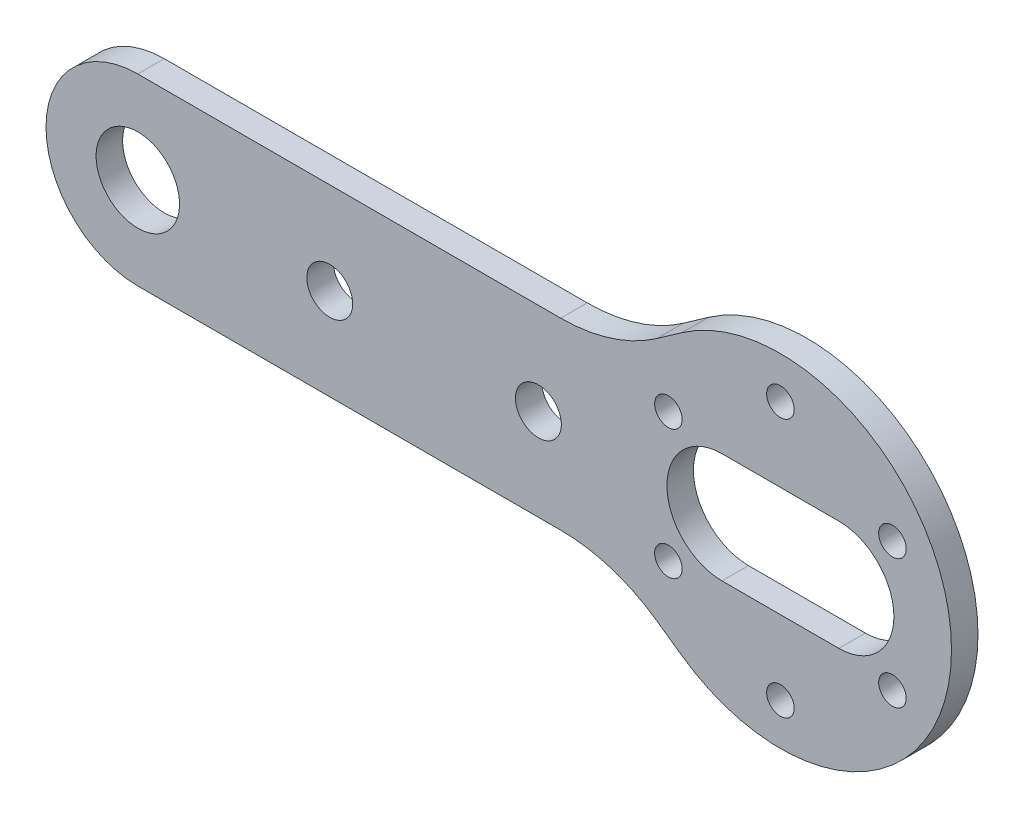
ISO-10303-21;
HEADER;
FILE_DESCRIPTION(('STEP AP214'),'2;1');
FILE_NAME('part.step','',(''),(''),'','','');
FILE_SCHEMA(('AUTOMOTIVE_DESIGN { 1 0 10303 214 1 1 1 1 }'));
ENDSEC;
DATA;
#1=APPLICATION_CONTEXT('core data for automotive mechanical design processes');
#2=APPLICATION_PROTOCOL_DEFINITION('international standard','automotive_design',2000,#1);
#3=PRODUCT_CONTEXT('',#1,'mechanical');
#4=PRODUCT('Part','Part','',(#3));
#5=PRODUCT_RELATED_PRODUCT_CATEGORY('part','',(#4));
#6=PRODUCT_DEFINITION_FORMATION('','',#4);
#7=PRODUCT_DEFINITION_CONTEXT('part definition',#1,'design');
#8=PRODUCT_DEFINITION('design','',#6,#7);
#9=PRODUCT_DEFINITION_SHAPE('','',#8);
#10=(LENGTH_UNIT() NAMED_UNIT(*) SI_UNIT(.MILLI.,.METRE.));
#11=(NAMED_UNIT(*) PLANE_ANGLE_UNIT() SI_UNIT($,.RADIAN.));
#12=(NAMED_UNIT(*) SI_UNIT($,.STERADIAN.) SOLID_ANGLE_UNIT());
#13=UNCERTAINTY_MEASURE_WITH_UNIT(LENGTH_MEASURE(1.E-05),#10,'distance_accuracy_value','');
#14=(GEOMETRIC_REPRESENTATION_CONTEXT(3) GLOBAL_UNCERTAINTY_ASSIGNED_CONTEXT((#13)) GLOBAL_UNIT_ASSIGNED_CONTEXT((#10,
#11,#12)) REPRESENTATION_CONTEXT('',''));
#15=CARTESIAN_POINT('',(0.,0.,0.));
#16=DIRECTION('',(0.,0.,1.));
#17=DIRECTION('',(1.,0.,0.));
#18=AXIS2_PLACEMENT_3D('',#15,#16,#17);
#19=CARTESIAN_POINT('',(94.3510316432399,14.5776463818247,67.3789074823256));
#20=DIRECTION('',(0.,0.,-1.));
#21=DIRECTION('',(-1.,0.,0.));
#22=AXIS2_PLACEMENT_3D('',#19,#20,#21);
#23=PLANE('',#22);
#24=CARTESIAN_POINT('',(65.3510316432399,14.5776463818247,67.3789074823256));
#25=DIRECTION('',(0.,0.,-1.));
#26=DIRECTION('',(-1.,0.,0.));
#27=AXIS2_PLACEMENT_3D('',#24,#25,#26);
#28=CIRCLE('',#27,2.74999999999999);
#29=CARTESIAN_POINT('',(62.6010316432399,14.5776463818247,67.3789074823256));
#30=VERTEX_POINT('',#29);
#31=EDGE_CURVE('E543',#30,#30,#28,.T.);
#32=ORIENTED_EDGE('',*,*,#31,.T.);
#33=EDGE_LOOP('',(#32));
#34=FACE_BOUND('',#33,.T.);
#35=CARTESIAN_POINT('',(40.3510316432399,14.5776463818247,67.3789074823256));
#36=DIRECTION('',(0.,0.,-1.));
#37=DIRECTION('',(-1.,0.,0.));
#38=AXIS2_PLACEMENT_3D('',#35,#36,#37);
#39=CIRCLE('',#38,2.74999999999999);
#40=CARTESIAN_POINT('',(37.6010316432399,14.5776463818247,67.3789074823256));
#41=VERTEX_POINT('',#40);
#42=EDGE_CURVE('E509',#41,#41,#39,.T.);
#43=ORIENTED_EDGE('',*,*,#42,.T.);
#44=EDGE_LOOP('',(#43));
#45=FACE_BOUND('',#44,.T.);
#46=CARTESIAN_POINT('',(107.774425401899,6.82764638182472,67.3789074823256));
#47=DIRECTION('',(0.,0.,1.));
#48=DIRECTION('',(1.,0.,0.));
#49=AXIS2_PLACEMENT_3D('',#46,#47,#48);
#50=CIRCLE('',#49,1.64999999999996);
#51=CARTESIAN_POINT('',(109.424425401899,6.82764638182472,67.3789074823256));
#52=VERTEX_POINT('',#51);
#53=EDGE_CURVE('E171',#52,#52,#50,.T.);
#54=ORIENTED_EDGE('',*,*,#53,.F.);
#55=EDGE_LOOP('',(#54));
#56=FACE_BOUND('',#55,.T.);
#57=CARTESIAN_POINT('',(107.774425401899,22.3276463818247,67.3789074823256));
#58=DIRECTION('',(0.,0.,1.));
#59=DIRECTION('',(1.,0.,0.));
#60=AXIS2_PLACEMENT_3D('',#57,#58,#59);
#61=CIRCLE('',#60,1.65000000000002);
#62=CARTESIAN_POINT('',(109.424425401899,22.3276463818247,67.3789074823256));
#63=VERTEX_POINT('',#62);
#64=EDGE_CURVE('E188',#63,#63,#61,.T.);
#65=ORIENTED_EDGE('',*,*,#64,.F.);
#66=EDGE_LOOP('',(#65));
#67=FACE_BOUND('',#66,.T.);
#68=CARTESIAN_POINT('',(80.9276378845811,22.3276463818247,67.3789074823256));
#69=DIRECTION('',(0.,0.,1.));
#70=DIRECTION('',(1.,0.,0.));
#71=AXIS2_PLACEMENT_3D('',#68,#69,#70);
#72=CIRCLE('',#71,1.65);
#73=CARTESIAN_POINT('',(82.5776378845811,22.3276463818247,67.3789074823256));
#74=VERTEX_POINT('',#73);
#75=EDGE_CURVE('E204',#74,#74,#72,.T.);
#76=ORIENTED_EDGE('',*,*,#75,.F.);
#77=EDGE_LOOP('',(#76));
#78=FACE_BOUND('',#77,.T.);
#79=CARTESIAN_POINT('',(94.3510316432399,-0.922353618175274,67.3789074823256));
#80=DIRECTION('',(0.,0.,1.));
#81=DIRECTION('',(1.,0.,0.));
#82=AXIS2_PLACEMENT_3D('',#79,#80,#81);
#83=CIRCLE('',#82,1.65000000000002);
#84=CARTESIAN_POINT('',(96.0010316432399,-0.922353618175274,67.3789074823256));
#85=VERTEX_POINT('',#84);
#86=EDGE_CURVE('E220',#85,#85,#83,.T.);
#87=ORIENTED_EDGE('',*,*,#86,.F.);
#88=EDGE_LOOP('',(#87));
#89=FACE_BOUND('',#88,.T.);
#90=CARTESIAN_POINT('',(94.3510316432399,14.5776463818247,67.3789074823256));
#91=DIRECTION('',(0.,0.,1.));
#92=DIRECTION('',(-1.,0.,0.));
#93=AXIS2_PLACEMENT_3D('',#90,#91,#92);
#94=CIRCLE('',#93,20.5);
#95=CARTESIAN_POINT('',(82.5630094814587,-2.19413150584587,67.3789074823256));
#96=VERTEX_POINT('',#95);
#97=CARTESIAN_POINT('',(82.5630094814587,31.3494242694953,67.3789074823256));
#98=VERTEX_POINT('',#97);
#99=EDGE_CURVE('E228',#96,#98,#94,.T.);
#100=ORIENTED_EDGE('',*,*,#99,.T.);
#101=DIRECTION('',(-0.818135506715639,-0.575025471306397,0.));
#102=VECTOR('',#101,1.);
#103=CARTESIAN_POINT('',(82.5630094814587,31.3494242694953,67.3789074823256));
#104=LINE('',#103,#102);
#105=CARTESIAN_POINT('',(79.526099767744,29.2149362475119,67.3789074823256));
#106=VERTEX_POINT('',#105);
#107=EDGE_CURVE('E232',#98,#106,#104,.T.);
#108=ORIENTED_EDGE('',*,*,#107,.T.);
#109=CARTESIAN_POINT('',(68.025590341616,45.5776463818247,67.3789074823256));
#110=DIRECTION('',(0.,0.,-1.));
#111=DIRECTION('',(-1.,0.,0.));
#112=AXIS2_PLACEMENT_3D('',#109,#110,#111);
#113=CIRCLE('',#112,20.);
#114=CARTESIAN_POINT('',(68.025590341616,25.5776463818247,67.3789074823256));
#115=VERTEX_POINT('',#114);
#116=EDGE_CURVE('E11',#106,#115,#113,.T.);
#117=ORIENTED_EDGE('',*,*,#116,.T.);
#118=DIRECTION('',(-1.,0.,0.));
#119=VECTOR('',#118,1.);
#120=CARTESIAN_POINT('',(74.3510316432399,25.5776463818247,67.3789074823256));
#121=LINE('',#120,#119);
#122=CARTESIAN_POINT('',(17.3510316432399,25.5776463818247,67.3789074823256));
#123=VERTEX_POINT('',#122);
#124=EDGE_CURVE('E236',#115,#123,#121,.T.);
#125=ORIENTED_EDGE('',*,*,#124,.T.);
#126=CARTESIAN_POINT('',(17.3510316432399,14.5776463818247,67.3789074823256));
#127=DIRECTION('',(0.,0.,1.));
#128=DIRECTION('',(1.,0.,0.));
#129=AXIS2_PLACEMENT_3D('',#126,#127,#128);
#130=CIRCLE('',#129,11.);
#131=CARTESIAN_POINT('',(17.3510316432399,3.57764638182472,67.3789074823256));
#132=VERTEX_POINT('',#131);
#133=EDGE_CURVE('E239',#123,#132,#130,.T.);
#134=ORIENTED_EDGE('',*,*,#133,.T.);
#135=DIRECTION('',(1.,0.,0.));
#136=VECTOR('',#135,1.);
#137=CARTESIAN_POINT('',(17.3510316432399,3.57764638182471,67.3789074823256));
#138=LINE('',#137,#136);
#139=CARTESIAN_POINT('',(68.025590341616,3.57764638182471,67.3789074823256));
#140=VERTEX_POINT('',#139);
#141=EDGE_CURVE('E242',#132,#140,#138,.T.);
#142=ORIENTED_EDGE('',*,*,#141,.T.);
#143=CARTESIAN_POINT('',(68.025590341616,-16.4223536181753,67.3789074823256));
#144=DIRECTION('',(0.,0.,-1.));
#145=DIRECTION('',(-1.,0.,0.));
#146=AXIS2_PLACEMENT_3D('',#143,#144,#145);
#147=CIRCLE('',#146,20.);
#148=CARTESIAN_POINT('',(79.526099767744,-0.0596434838625033,67.3789074823256));
#149=VERTEX_POINT('',#148);
#150=EDGE_CURVE('E299',#140,#149,#147,.T.);
#151=ORIENTED_EDGE('',*,*,#150,.T.);
#152=DIRECTION('',(0.818135506715639,-0.575025471306397,0.));
#153=VECTOR('',#152,1.);
#154=CARTESIAN_POINT('',(74.3510316432399,3.57764638182471,67.3789074823256));
#155=LINE('',#154,#153);
#156=EDGE_CURVE('E246',#149,#96,#155,.T.);
#157=ORIENTED_EDGE('',*,*,#156,.T.);
#158=EDGE_LOOP('',(#100,#108,#117,#125,#134,#142,#151,#157));
#159=FACE_BOUND('',#158,.T.);
#160=CARTESIAN_POINT('',(80.9276378845811,6.82764638182472,67.3789074823256));
#161=DIRECTION('',(0.,0.,1.));
#162=DIRECTION('',(1.,0.,0.));
#163=AXIS2_PLACEMENT_3D('',#160,#161,#162);
#164=CIRCLE('',#163,1.64999999999997);
#165=CARTESIAN_POINT('',(82.5776378845811,6.82764638182472,67.3789074823256));
#166=VERTEX_POINT('',#165);
#167=EDGE_CURVE('E212',#166,#166,#164,.T.);
#168=ORIENTED_EDGE('',*,*,#167,.F.);
#169=EDGE_LOOP('',(#168));
#170=FACE_BOUND('',#169,.T.);
#171=CARTESIAN_POINT('',(94.3510316432399,30.0776463818247,67.3789074823256));
#172=DIRECTION('',(0.,0.,1.));
#173=DIRECTION('',(1.,0.,0.));
#174=AXIS2_PLACEMENT_3D('',#171,#172,#173);
#175=CIRCLE('',#174,1.64999999999999);
#176=CARTESIAN_POINT('',(96.0010316432399,30.0776463818247,67.3789074823256));
#177=VERTEX_POINT('',#176);
#178=EDGE_CURVE('E196',#177,#177,#175,.T.);
#179=ORIENTED_EDGE('',*,*,#178,.F.);
#180=EDGE_LOOP('',(#179));
#181=FACE_BOUND('',#180,.T.);
#182=CARTESIAN_POINT('',(87.3510316432399,14.5776463818247,67.3789074823256));
#183=DIRECTION('',(0.,0.,1.));
#184=DIRECTION('',(1.,0.,0.));
#185=AXIS2_PLACEMENT_3D('',#182,#183,#184);
#186=CIRCLE('',#185,6.6);
#187=CARTESIAN_POINT('',(87.3510316432399,21.1776463818247,67.3789074823256));
#188=VERTEX_POINT('',#187);
#189=CARTESIAN_POINT('',(87.3510316432399,7.97764638182471,67.3789074823256));
#190=VERTEX_POINT('',#189);
#191=EDGE_CURVE('E132',#188,#190,#186,.T.);
#192=ORIENTED_EDGE('',*,*,#191,.F.);
#193=DIRECTION('',(-1.,0.,0.));
#194=VECTOR('',#193,1.);
#195=CARTESIAN_POINT('',(87.3510316432399,21.1776463818247,67.3789074823256));
#196=LINE('',#195,#194);
#197=CARTESIAN_POINT('',(101.35103164324,21.1776463818247,67.3789074823256));
#198=VERTEX_POINT('',#197);
#199=EDGE_CURVE('E162',#198,#188,#196,.T.);
#200=ORIENTED_EDGE('',*,*,#199,.F.);
#201=CARTESIAN_POINT('',(101.35103164324,14.5776463818247,67.3789074823256));
#202=DIRECTION('',(0.,0.,1.));
#203=DIRECTION('',(1.,0.,0.));
#204=AXIS2_PLACEMENT_3D('',#201,#202,#203);
#205=CIRCLE('',#204,6.6);
#206=CARTESIAN_POINT('',(101.35103164324,7.97764638182471,67.3789074823256));
#207=VERTEX_POINT('',#206);
#208=EDGE_CURVE('E158',#207,#198,#205,.T.);
#209=ORIENTED_EDGE('',*,*,#208,.F.);
#210=DIRECTION('',(1.,0.,0.));
#211=VECTOR('',#210,1.);
#212=CARTESIAN_POINT('',(87.3510316432399,7.97764638182471,67.3789074823256));
#213=LINE('',#212,#211);
#214=EDGE_CURVE('E143',#190,#207,#213,.T.);
#215=ORIENTED_EDGE('',*,*,#214,.F.);
#216=EDGE_LOOP('',(#192,#200,#209,#215));
#217=FACE_BOUND('',#216,.T.);
#218=CARTESIAN_POINT('',(17.3510316432399,14.5776463818247,67.3789074823256));
#219=DIRECTION('',(0.,0.,1.));
#220=DIRECTION('',(-1.,0.,0.));
#221=AXIS2_PLACEMENT_3D('',#218,#219,#220);
#222=CIRCLE('',#221,5.00000000000003);
#223=CARTESIAN_POINT('',(12.3510316432398,14.5776463818247,67.3789074823256));
#224=VERTEX_POINT('',#223);
#225=EDGE_CURVE('E508',#224,#224,#222,.T.);
#226=ORIENTED_EDGE('',*,*,#225,.F.);
#227=EDGE_LOOP('',(#226));
#228=FACE_BOUND('',#227,.T.);
#229=ADVANCED_FACE('F43',(#34,#45,#56,#67,#78,#89,#159,#170,#181,#217,#228),#23,.F.);
#230=CARTESIAN_POINT('',(94.3510316432399,14.5776463818247,64.2039074823256));
#231=DIRECTION('',(0.,0.,-1.));
#232=DIRECTION('',(-1.,0.,0.));
#233=AXIS2_PLACEMENT_3D('',#230,#231,#232);
#234=PLANE('',#233);
#235=CARTESIAN_POINT('',(65.3510316432399,14.5776463818247,64.2039074823256));
#236=DIRECTION('',(0.,0.,-1.));
#237=DIRECTION('',(-1.,0.,0.));
#238=AXIS2_PLACEMENT_3D('',#235,#236,#237);
#239=CIRCLE('',#238,2.74999999999999);
#240=CARTESIAN_POINT('',(62.6010316432399,14.5776463818247,64.2039074823256));
#241=VERTEX_POINT('',#240);
#242=EDGE_CURVE('E546',#241,#241,#239,.T.);
#243=ORIENTED_EDGE('',*,*,#242,.F.);
#244=EDGE_LOOP('',(#243));
#245=FACE_BOUND('',#244,.T.);
#246=CARTESIAN_POINT('',(40.3510316432399,14.5776463818247,64.2039074823256));
#247=DIRECTION('',(0.,0.,-1.));
#248=DIRECTION('',(-1.,0.,0.));
#249=AXIS2_PLACEMENT_3D('',#246,#247,#248);
#250=CIRCLE('',#249,2.74999999999999);
#251=CARTESIAN_POINT('',(37.6010316432399,14.5776463818247,64.2039074823256));
#252=VERTEX_POINT('',#251);
#253=EDGE_CURVE('E517',#252,#252,#250,.T.);
#254=ORIENTED_EDGE('',*,*,#253,.F.);
#255=EDGE_LOOP('',(#254));
#256=FACE_BOUND('',#255,.T.);
#257=CARTESIAN_POINT('',(107.774425401899,6.82764638182472,64.2039074823256));
#258=DIRECTION('',(0.,0.,1.));
#259=DIRECTION('',(1.,0.,0.));
#260=AXIS2_PLACEMENT_3D('',#257,#258,#259);
#261=CIRCLE('',#260,1.64999999999996);
#262=CARTESIAN_POINT('',(109.424425401899,6.82764638182472,64.2039074823256));
#263=VERTEX_POINT('',#262);
#264=EDGE_CURVE('E514',#263,#263,#261,.T.);
#265=ORIENTED_EDGE('',*,*,#264,.T.);
#266=EDGE_LOOP('',(#265));
#267=FACE_BOUND('',#266,.T.);
#268=CARTESIAN_POINT('',(107.774425401899,22.3276463818247,64.2039074823256));
#269=DIRECTION('',(0.,0.,1.));
#270=DIRECTION('',(1.,0.,0.));
#271=AXIS2_PLACEMENT_3D('',#268,#269,#270);
#272=CIRCLE('',#271,1.65000000000002);
#273=CARTESIAN_POINT('',(109.424425401899,22.3276463818247,64.2039074823256));
#274=VERTEX_POINT('',#273);
#275=EDGE_CURVE('E152',#274,#274,#272,.T.);
#276=ORIENTED_EDGE('',*,*,#275,.T.);
#277=EDGE_LOOP('',(#276));
#278=FACE_BOUND('',#277,.T.);
#279=CARTESIAN_POINT('',(80.9276378845811,22.3276463818247,64.2039074823256));
#280=DIRECTION('',(0.,0.,1.));
#281=DIRECTION('',(1.,0.,0.));
#282=AXIS2_PLACEMENT_3D('',#279,#280,#281);
#283=CIRCLE('',#282,1.65);
#284=CARTESIAN_POINT('',(82.5776378845811,22.3276463818247,64.2039074823256));
#285=VERTEX_POINT('',#284);
#286=EDGE_CURVE('E200',#285,#285,#283,.T.);
#287=ORIENTED_EDGE('',*,*,#286,.T.);
#288=EDGE_LOOP('',(#287));
#289=FACE_BOUND('',#288,.T.);
#290=CARTESIAN_POINT('',(94.3510316432399,-0.922353618175274,64.2039074823256));
#291=DIRECTION('',(0.,0.,1.));
#292=DIRECTION('',(1.,0.,0.));
#293=AXIS2_PLACEMENT_3D('',#290,#291,#292);
#294=CIRCLE('',#293,1.65000000000002);
#295=CARTESIAN_POINT('',(96.0010316432399,-0.922353618175274,64.2039074823256));
#296=VERTEX_POINT('',#295);
#297=EDGE_CURVE('E216',#296,#296,#294,.T.);
#298=ORIENTED_EDGE('',*,*,#297,.T.);
#299=EDGE_LOOP('',(#298));
#300=FACE_BOUND('',#299,.T.);
#301=CARTESIAN_POINT('',(94.3510316432399,14.5776463818247,64.2039074823256));
#302=DIRECTION('',(0.,0.,1.));
#303=DIRECTION('',(-1.,0.,0.));
#304=AXIS2_PLACEMENT_3D('',#301,#302,#303);
#305=CIRCLE('',#304,20.5);
#306=CARTESIAN_POINT('',(82.5630094814587,-2.19413150584587,64.2039074823256));
#307=VERTEX_POINT('',#306);
#308=CARTESIAN_POINT('',(82.5630094814587,31.3494242694953,64.2039074823256));
#309=VERTEX_POINT('',#308);
#310=EDGE_CURVE('E224',#307,#309,#305,.T.);
#311=ORIENTED_EDGE('',*,*,#310,.F.);
#312=DIRECTION('',(0.818135506715639,-0.575025471306397,0.));
#313=VECTOR('',#312,1.);
#314=CARTESIAN_POINT('',(74.3510316432399,3.57764638182471,64.2039074823256));
#315=LINE('',#314,#313);
#316=CARTESIAN_POINT('',(79.526099767744,-0.0596434838625033,64.2039074823256));
#317=VERTEX_POINT('',#316);
#318=EDGE_CURVE('E233',#317,#307,#315,.T.);
#319=ORIENTED_EDGE('',*,*,#318,.F.);
#320=CARTESIAN_POINT('',(68.025590341616,-16.4223536181753,64.2039074823256));
#321=DIRECTION('',(0.,0.,-1.));
#322=DIRECTION('',(-1.,0.,0.));
#323=AXIS2_PLACEMENT_3D('',#320,#321,#322);
#324=CIRCLE('',#323,20.);
#325=CARTESIAN_POINT('',(68.025590341616,3.57764638182471,64.2039074823256));
#326=VERTEX_POINT('',#325);
#327=EDGE_CURVE('E296',#317,#326,#324,.F.);
#328=ORIENTED_EDGE('',*,*,#327,.T.);
#329=DIRECTION('',(1.,0.,0.));
#330=VECTOR('',#329,1.);
#331=CARTESIAN_POINT('',(17.3510316432399,3.57764638182471,64.2039074823256));
#332=LINE('',#331,#330);
#333=CARTESIAN_POINT('',(17.3510316432399,3.57764638182472,64.2039074823256));
#334=VERTEX_POINT('',#333);
#335=EDGE_CURVE('E262',#334,#326,#332,.T.);
#336=ORIENTED_EDGE('',*,*,#335,.F.);
#337=CARTESIAN_POINT('',(17.3510316432399,14.5776463818247,64.2039074823256));
#338=DIRECTION('',(0.,0.,1.));
#339=DIRECTION('',(1.,0.,0.));
#340=AXIS2_PLACEMENT_3D('',#337,#338,#339);
#341=CIRCLE('',#340,11.);
#342=CARTESIAN_POINT('',(17.3510316432399,25.5776463818247,64.2039074823256));
#343=VERTEX_POINT('',#342);
#344=EDGE_CURVE('E259',#343,#334,#341,.T.);
#345=ORIENTED_EDGE('',*,*,#344,.F.);
#346=DIRECTION('',(-1.,0.,0.));
#347=VECTOR('',#346,1.);
#348=CARTESIAN_POINT('',(74.3510316432399,25.5776463818247,64.2039074823256));
#349=LINE('',#348,#347);
#350=CARTESIAN_POINT('',(68.025590341616,25.5776463818247,64.2039074823256));
#351=VERTEX_POINT('',#350);
#352=EDGE_CURVE('E256',#351,#343,#349,.T.);
#353=ORIENTED_EDGE('',*,*,#352,.F.);
#354=CARTESIAN_POINT('',(68.025590341616,45.5776463818247,64.2039074823256));
#355=DIRECTION('',(0.,0.,-1.));
#356=DIRECTION('',(-1.,0.,0.));
#357=AXIS2_PLACEMENT_3D('',#354,#355,#356);
#358=CIRCLE('',#357,20.);
#359=CARTESIAN_POINT('',(79.526099767744,29.2149362475119,64.2039074823256));
#360=VERTEX_POINT('',#359);
#361=EDGE_CURVE('E52',#351,#360,#358,.F.);
#362=ORIENTED_EDGE('',*,*,#361,.T.);
#363=DIRECTION('',(-0.818135506715639,-0.575025471306397,0.));
#364=VECTOR('',#363,1.);
#365=CARTESIAN_POINT('',(82.5630094814587,31.3494242694953,64.2039074823256));
#366=LINE('',#365,#364);
#367=EDGE_CURVE('E253',#309,#360,#366,.T.);
#368=ORIENTED_EDGE('',*,*,#367,.F.);
#369=EDGE_LOOP('',(#311,#319,#328,#336,#345,#353,#362,#368));
#370=FACE_BOUND('',#369,.T.);
#371=CARTESIAN_POINT('',(80.9276378845811,6.82764638182472,64.2039074823256));
#372=DIRECTION('',(0.,0.,1.));
#373=DIRECTION('',(1.,0.,0.));
#374=AXIS2_PLACEMENT_3D('',#371,#372,#373);
#375=CIRCLE('',#374,1.64999999999997);
#376=CARTESIAN_POINT('',(82.5776378845811,6.82764638182472,64.2039074823256));
#377=VERTEX_POINT('',#376);
#378=EDGE_CURVE('E208',#377,#377,#375,.T.);
#379=ORIENTED_EDGE('',*,*,#378,.T.);
#380=EDGE_LOOP('',(#379));
#381=FACE_BOUND('',#380,.T.);
#382=CARTESIAN_POINT('',(94.3510316432399,30.0776463818247,64.2039074823256));
#383=DIRECTION('',(0.,0.,1.));
#384=DIRECTION('',(1.,0.,0.));
#385=AXIS2_PLACEMENT_3D('',#382,#383,#384);
#386=CIRCLE('',#385,1.64999999999999);
#387=CARTESIAN_POINT('',(96.0010316432399,30.0776463818247,64.2039074823256));
#388=VERTEX_POINT('',#387);
#389=EDGE_CURVE('E192',#388,#388,#386,.T.);
#390=ORIENTED_EDGE('',*,*,#389,.T.);
#391=EDGE_LOOP('',(#390));
#392=FACE_BOUND('',#391,.T.);
#393=DIRECTION('',(-1.,0.,0.));
#394=VECTOR('',#393,1.);
#395=CARTESIAN_POINT('',(87.3510316432399,21.1776463818247,64.2039074823256));
#396=LINE('',#395,#394);
#397=CARTESIAN_POINT('',(101.35103164324,21.1776463818247,64.2039074823256));
#398=VERTEX_POINT('',#397);
#399=CARTESIAN_POINT('',(87.3510316432399,21.1776463818247,64.2039074823256));
#400=VERTEX_POINT('',#399);
#401=EDGE_CURVE('E144',#398,#400,#396,.T.);
#402=ORIENTED_EDGE('',*,*,#401,.T.);
#403=CARTESIAN_POINT('',(87.3510316432399,14.5776463818247,64.2039074823256));
#404=DIRECTION('',(0.,0.,1.));
#405=DIRECTION('',(1.,0.,0.));
#406=AXIS2_PLACEMENT_3D('',#403,#404,#405);
#407=CIRCLE('',#406,6.6);
#408=CARTESIAN_POINT('',(87.3510316432399,7.97764638182471,64.2039074823256));
#409=VERTEX_POINT('',#408);
#410=EDGE_CURVE('E168',#400,#409,#407,.T.);
#411=ORIENTED_EDGE('',*,*,#410,.T.);
#412=DIRECTION('',(1.,0.,0.));
#413=VECTOR('',#412,1.);
#414=CARTESIAN_POINT('',(87.3510316432399,7.97764638182471,64.2039074823256));
#415=LINE('',#414,#413);
#416=CARTESIAN_POINT('',(101.35103164324,7.97764638182471,64.2039074823256));
#417=VERTEX_POINT('',#416);
#418=EDGE_CURVE('E150',#409,#417,#415,.T.);
#419=ORIENTED_EDGE('',*,*,#418,.T.);
#420=CARTESIAN_POINT('',(101.35103164324,14.5776463818247,64.2039074823256));
#421=DIRECTION('',(0.,0.,1.));
#422=DIRECTION('',(1.,0.,0.));
#423=AXIS2_PLACEMENT_3D('',#420,#421,#422);
#424=CIRCLE('',#423,6.6);
#425=EDGE_CURVE('E174',#417,#398,#424,.T.);
#426=ORIENTED_EDGE('',*,*,#425,.T.);
#427=EDGE_LOOP('',(#402,#411,#419,#426));
#428=FACE_BOUND('',#427,.T.);
#429=CARTESIAN_POINT('',(17.3510316432399,14.5776463818247,64.2039074823256));
#430=DIRECTION('',(0.,0.,1.));
#431=DIRECTION('',(-1.,0.,0.));
#432=AXIS2_PLACEMENT_3D('',#429,#430,#431);
#433=CIRCLE('',#432,5.00000000000003);
#434=CARTESIAN_POINT('',(12.3510316432398,14.5776463818247,64.2039074823256));
#435=VERTEX_POINT('',#434);
#436=EDGE_CURVE('E505',#435,#435,#433,.T.);
#437=ORIENTED_EDGE('',*,*,#436,.T.);
#438=EDGE_LOOP('',(#437));
#439=FACE_BOUND('',#438,.T.);
#440=ADVANCED_FACE('F318',(#245,#256,#267,#278,#289,#300,#370,#381,#392,#428,#439),#234,.T.);
#441=CARTESIAN_POINT('',(94.3510316432399,14.5776463818247,67.3789074823256));
#442=DIRECTION('',(0.,0.,-1.));
#443=DIRECTION('',(-1.,0.,0.));
#444=AXIS2_PLACEMENT_3D('',#441,#442,#443);
#445=CYLINDRICAL_SURFACE('',#444,20.5);
#446=ORIENTED_EDGE('',*,*,#310,.T.);
#447=DIRECTION('',(0.,0.,-1.));
#448=VECTOR('',#447,1.);
#449=CARTESIAN_POINT('',(82.5630094814587,31.3494242694953,67.3789074823256));
#450=LINE('',#449,#448);
#451=EDGE_CURVE('E279',#98,#309,#450,.T.);
#452=ORIENTED_EDGE('',*,*,#451,.F.);
#453=ORIENTED_EDGE('',*,*,#99,.F.);
#454=DIRECTION('',(0.,0.,-1.));
#455=VECTOR('',#454,1.);
#456=CARTESIAN_POINT('',(82.5630094814587,-2.19413150584587,67.3789074823256));
#457=LINE('',#456,#455);
#458=EDGE_CURVE('E249',#96,#307,#457,.T.);
#459=ORIENTED_EDGE('',*,*,#458,.T.);
#460=EDGE_LOOP('',(#446,#452,#453,#459));
#461=FACE_BOUND('',#460,.T.);
#462=ADVANCED_FACE('F337',(#461),#445,.T.);
#463=CARTESIAN_POINT('',(82.5630094814587,31.3494242694953,67.3789074823256));
#464=DIRECTION('',(0.575025471306397,-0.818135506715639,0.));
#465=DIRECTION('',(0.81813550671564,0.575025471306397,0.));
#466=AXIS2_PLACEMENT_3D('',#463,#464,#465);
#467=PLANE('',#466);
#468=ORIENTED_EDGE('',*,*,#367,.T.);
#469=DIRECTION('',(0.,0.,-1.));
#470=VECTOR('',#469,1.);
#471=CARTESIAN_POINT('',(79.526099767744,29.2149362475119,67.3789074823256));
#472=LINE('',#471,#470);
#473=EDGE_CURVE('E59',#360,#106,#472,.F.);
#474=ORIENTED_EDGE('',*,*,#473,.T.);
#475=ORIENTED_EDGE('',*,*,#107,.F.);
#476=ORIENTED_EDGE('',*,*,#451,.T.);
#477=EDGE_LOOP('',(#468,#474,#475,#476));
#478=FACE_BOUND('',#477,.T.);
#479=ADVANCED_FACE('F335',(#478),#467,.F.);
#480=CARTESIAN_POINT('',(74.3510316432399,25.5776463818247,67.3789074823256));
#481=DIRECTION('',(0.,-1.,0.));
#482=DIRECTION('',(1.,0.,0.));
#483=AXIS2_PLACEMENT_3D('',#480,#481,#482);
#484=PLANE('',#483);
#485=ORIENTED_EDGE('',*,*,#124,.F.);
#486=DIRECTION('',(0.,0.,-1.));
#487=VECTOR('',#486,1.);
#488=CARTESIAN_POINT('',(68.025590341616,25.5776463818247,64.2039074823256));
#489=LINE('',#488,#487);
#490=EDGE_CURVE('E290',#115,#351,#489,.T.);
#491=ORIENTED_EDGE('',*,*,#490,.T.);
#492=ORIENTED_EDGE('',*,*,#352,.T.);
#493=DIRECTION('',(0.,0.,-1.));
#494=VECTOR('',#493,1.);
#495=CARTESIAN_POINT('',(17.3510316432399,25.5776463818247,67.3789074823256));
#496=LINE('',#495,#494);
#497=EDGE_CURVE('E275',#123,#343,#496,.T.);
#498=ORIENTED_EDGE('',*,*,#497,.F.);
#499=EDGE_LOOP('',(#485,#491,#492,#498));
#500=FACE_BOUND('',#499,.T.);
#501=ADVANCED_FACE('F330',(#500),#484,.F.);
#502=CARTESIAN_POINT('',(17.3510316432399,14.5776463818247,67.3789074823256));
#503=DIRECTION('',(0.,0.,-1.));
#504=DIRECTION('',(-1.,0.,0.));
#505=AXIS2_PLACEMENT_3D('',#502,#503,#504);
#506=CYLINDRICAL_SURFACE('',#505,11.);
#507=ORIENTED_EDGE('',*,*,#344,.T.);
#508=DIRECTION('',(0.,0.,-1.));
#509=VECTOR('',#508,1.);
#510=CARTESIAN_POINT('',(17.3510316432399,3.57764638182472,67.3789074823256));
#511=LINE('',#510,#509);
#512=EDGE_CURVE('E271',#132,#334,#511,.T.);
#513=ORIENTED_EDGE('',*,*,#512,.F.);
#514=ORIENTED_EDGE('',*,*,#133,.F.);
#515=ORIENTED_EDGE('',*,*,#497,.T.);
#516=EDGE_LOOP('',(#507,#513,#514,#515));
#517=FACE_BOUND('',#516,.T.);
#518=ADVANCED_FACE('F326',(#517),#506,.T.);
#519=CARTESIAN_POINT('',(17.3510316432399,3.57764638182471,67.3789074823256));
#520=DIRECTION('',(0.,1.,0.));
#521=DIRECTION('',(-1.,0.,0.));
#522=AXIS2_PLACEMENT_3D('',#519,#520,#521);
#523=PLANE('',#522);
#524=ORIENTED_EDGE('',*,*,#335,.T.);
#525=DIRECTION('',(0.,0.,-1.));
#526=VECTOR('',#525,1.);
#527=CARTESIAN_POINT('',(68.025590341616,3.57764638182471,67.3789074823256));
#528=LINE('',#527,#526);
#529=EDGE_CURVE('E287',#326,#140,#528,.F.);
#530=ORIENTED_EDGE('',*,*,#529,.T.);
#531=ORIENTED_EDGE('',*,*,#141,.F.);
#532=ORIENTED_EDGE('',*,*,#512,.T.);
#533=EDGE_LOOP('',(#524,#530,#531,#532));
#534=FACE_BOUND('',#533,.T.);
#535=ADVANCED_FACE('F322',(#534),#523,.F.);
#536=CARTESIAN_POINT('',(74.3510316432399,3.57764638182471,67.3789074823256));
#537=DIRECTION('',(0.575025471306397,0.818135506715639,0.));
#538=DIRECTION('',(-0.818135506715639,0.575025471306397,0.));
#539=AXIS2_PLACEMENT_3D('',#536,#537,#538);
#540=PLANE('',#539);
#541=ORIENTED_EDGE('',*,*,#156,.F.);
#542=DIRECTION('',(0.,0.,-1.));
#543=VECTOR('',#542,1.);
#544=CARTESIAN_POINT('',(79.526099767744,-0.0596434838625041,64.2039074823256));
#545=LINE('',#544,#543);
#546=EDGE_CURVE('E283',#149,#317,#545,.T.);
#547=ORIENTED_EDGE('',*,*,#546,.T.);
#548=ORIENTED_EDGE('',*,*,#318,.T.);
#549=ORIENTED_EDGE('',*,*,#458,.F.);
#550=EDGE_LOOP('',(#541,#547,#548,#549));
#551=FACE_BOUND('',#550,.T.);
#552=ADVANCED_FACE('F312',(#551),#540,.F.);
#553=CARTESIAN_POINT('',(94.3510316432399,-0.922353618175274,67.3789074823256));
#554=DIRECTION('',(0.,0.,-1.));
#555=DIRECTION('',(-1.,0.,0.));
#556=AXIS2_PLACEMENT_3D('',#553,#554,#555);
#557=CYLINDRICAL_SURFACE('',#556,1.65000000000002);
#558=ORIENTED_EDGE('',*,*,#86,.T.);
#559=EDGE_LOOP('',(#558));
#560=FACE_BOUND('',#559,.T.);
#561=ORIENTED_EDGE('',*,*,#297,.F.);
#562=EDGE_LOOP('',(#561));
#563=FACE_BOUND('',#562,.T.);
#564=ADVANCED_FACE('F357',(#560,#563),#557,.F.);
#565=CARTESIAN_POINT('',(80.9276378845811,6.82764638182472,67.3789074823256));
#566=DIRECTION('',(0.,0.,-1.));
#567=DIRECTION('',(-1.,0.,0.));
#568=AXIS2_PLACEMENT_3D('',#565,#566,#567);
#569=CYLINDRICAL_SURFACE('',#568,1.64999999999997);
#570=ORIENTED_EDGE('',*,*,#167,.T.);
#571=EDGE_LOOP('',(#570));
#572=FACE_BOUND('',#571,.T.);
#573=ORIENTED_EDGE('',*,*,#378,.F.);
#574=EDGE_LOOP('',(#573));
#575=FACE_BOUND('',#574,.T.);
#576=ADVANCED_FACE('F473',(#572,#575),#569,.F.);
#577=CARTESIAN_POINT('',(80.9276378845811,22.3276463818247,67.3789074823256));
#578=DIRECTION('',(0.,0.,-1.));
#579=DIRECTION('',(-1.,0.,0.));
#580=AXIS2_PLACEMENT_3D('',#577,#578,#579);
#581=CYLINDRICAL_SURFACE('',#580,1.65);
#582=ORIENTED_EDGE('',*,*,#75,.T.);
#583=EDGE_LOOP('',(#582));
#584=FACE_BOUND('',#583,.T.);
#585=ORIENTED_EDGE('',*,*,#286,.F.);
#586=EDGE_LOOP('',(#585));
#587=FACE_BOUND('',#586,.T.);
#588=ADVANCED_FACE('F465',(#584,#587),#581,.F.);
#589=CARTESIAN_POINT('',(94.3510316432399,30.0776463818247,67.3789074823256));
#590=DIRECTION('',(0.,0.,-1.));
#591=DIRECTION('',(-1.,0.,0.));
#592=AXIS2_PLACEMENT_3D('',#589,#590,#591);
#593=CYLINDRICAL_SURFACE('',#592,1.64999999999999);
#594=ORIENTED_EDGE('',*,*,#178,.T.);
#595=EDGE_LOOP('',(#594));
#596=FACE_BOUND('',#595,.T.);
#597=ORIENTED_EDGE('',*,*,#389,.F.);
#598=EDGE_LOOP('',(#597));
#599=FACE_BOUND('',#598,.T.);
#600=ADVANCED_FACE('F457',(#596,#599),#593,.F.);
#601=CARTESIAN_POINT('',(107.774425401899,22.3276463818247,67.3789074823256));
#602=DIRECTION('',(0.,0.,-1.));
#603=DIRECTION('',(-1.,0.,0.));
#604=AXIS2_PLACEMENT_3D('',#601,#602,#603);
#605=CYLINDRICAL_SURFACE('',#604,1.65000000000002);
#606=ORIENTED_EDGE('',*,*,#64,.T.);
#607=EDGE_LOOP('',(#606));
#608=FACE_BOUND('',#607,.T.);
#609=ORIENTED_EDGE('',*,*,#275,.F.);
#610=EDGE_LOOP('',(#609));
#611=FACE_BOUND('',#610,.T.);
#612=ADVANCED_FACE('F450',(#608,#611),#605,.F.);
#613=CARTESIAN_POINT('',(87.3510316432399,14.5776463818247,67.3789074823256));
#614=DIRECTION('',(0.,0.,-1.));
#615=DIRECTION('',(-1.,0.,0.));
#616=AXIS2_PLACEMENT_3D('',#613,#614,#615);
#617=CYLINDRICAL_SURFACE('',#616,6.6);
#618=ORIENTED_EDGE('',*,*,#410,.F.);
#619=DIRECTION('',(0.,0.,-1.));
#620=VECTOR('',#619,1.);
#621=CARTESIAN_POINT('',(87.3510316432399,21.1776463818247,67.3789074823256));
#622=LINE('',#621,#620);
#623=EDGE_CURVE('E138',#188,#400,#622,.T.);
#624=ORIENTED_EDGE('',*,*,#623,.F.);
#625=ORIENTED_EDGE('',*,*,#191,.T.);
#626=DIRECTION('',(0.,0.,-1.));
#627=VECTOR('',#626,1.);
#628=CARTESIAN_POINT('',(87.3510316432399,7.97764638182471,67.3789074823256));
#629=LINE('',#628,#627);
#630=EDGE_CURVE('E135',#190,#409,#629,.T.);
#631=ORIENTED_EDGE('',*,*,#630,.T.);
#632=EDGE_LOOP('',(#618,#624,#625,#631));
#633=FACE_BOUND('',#632,.T.);
#634=ADVANCED_FACE('F134',(#633),#617,.F.);
#635=CARTESIAN_POINT('',(87.3510316432399,7.97764638182471,67.3789074823256));
#636=DIRECTION('',(0.,1.,0.));
#637=DIRECTION('',(0.,0.,1.));
#638=AXIS2_PLACEMENT_3D('',#635,#636,#637);
#639=PLANE('',#638);
#640=ORIENTED_EDGE('',*,*,#418,.F.);
#641=ORIENTED_EDGE('',*,*,#630,.F.);
#642=ORIENTED_EDGE('',*,*,#214,.T.);
#643=DIRECTION('',(0.,0.,-1.));
#644=VECTOR('',#643,1.);
#645=CARTESIAN_POINT('',(101.35103164324,7.97764638182471,67.3789074823256));
#646=LINE('',#645,#644);
#647=EDGE_CURVE('E153',#207,#417,#646,.T.);
#648=ORIENTED_EDGE('',*,*,#647,.T.);
#649=EDGE_LOOP('',(#640,#641,#642,#648));
#650=FACE_BOUND('',#649,.T.);
#651=ADVANCED_FACE('F147',(#650),#639,.T.);
#652=CARTESIAN_POINT('',(101.35103164324,14.5776463818247,67.3789074823256));
#653=DIRECTION('',(0.,0.,-1.));
#654=DIRECTION('',(-1.,0.,0.));
#655=AXIS2_PLACEMENT_3D('',#652,#653,#654);
#656=CYLINDRICAL_SURFACE('',#655,6.6);
#657=ORIENTED_EDGE('',*,*,#425,.F.);
#658=ORIENTED_EDGE('',*,*,#647,.F.);
#659=ORIENTED_EDGE('',*,*,#208,.T.);
#660=DIRECTION('',(0.,0.,-1.));
#661=VECTOR('',#660,1.);
#662=CARTESIAN_POINT('',(101.35103164324,21.1776463818247,67.3789074823256));
#663=LINE('',#662,#661);
#664=EDGE_CURVE('E183',#198,#398,#663,.T.);
#665=ORIENTED_EDGE('',*,*,#664,.T.);
#666=EDGE_LOOP('',(#657,#658,#659,#665));
#667=FACE_BOUND('',#666,.T.);
#668=ADVANCED_FACE('F429',(#667),#656,.F.);
#669=CARTESIAN_POINT('',(87.3510316432399,21.1776463818247,67.3789074823256));
#670=DIRECTION('',(0.,-1.,0.));
#671=DIRECTION('',(0.,0.,-1.));
#672=AXIS2_PLACEMENT_3D('',#669,#670,#671);
#673=PLANE('',#672);
#674=ORIENTED_EDGE('',*,*,#401,.F.);
#675=ORIENTED_EDGE('',*,*,#664,.F.);
#676=ORIENTED_EDGE('',*,*,#199,.T.);
#677=ORIENTED_EDGE('',*,*,#623,.T.);
#678=EDGE_LOOP('',(#674,#675,#676,#677));
#679=FACE_BOUND('',#678,.T.);
#680=ADVANCED_FACE('F421',(#679),#673,.T.);
#681=CARTESIAN_POINT('',(107.774425401899,6.82764638182472,67.3789074823256));
#682=DIRECTION('',(0.,0.,-1.));
#683=DIRECTION('',(-1.,0.,0.));
#684=AXIS2_PLACEMENT_3D('',#681,#682,#683);
#685=CYLINDRICAL_SURFACE('',#684,1.64999999999996);
#686=ORIENTED_EDGE('',*,*,#53,.T.);
#687=EDGE_LOOP('',(#686));
#688=FACE_BOUND('',#687,.T.);
#689=ORIENTED_EDGE('',*,*,#264,.F.);
#690=EDGE_LOOP('',(#689));
#691=FACE_BOUND('',#690,.T.);
#692=ADVANCED_FACE('F413',(#688,#691),#685,.F.);
#693=CARTESIAN_POINT('',(17.3510316432399,14.5776463818247,67.3789074823256));
#694=DIRECTION('',(0.,0.,-1.));
#695=DIRECTION('',(-1.,0.,0.));
#696=AXIS2_PLACEMENT_3D('',#693,#694,#695);
#697=CYLINDRICAL_SURFACE('',#696,5.00000000000003);
#698=ORIENTED_EDGE('',*,*,#225,.T.);
#699=EDGE_LOOP('',(#698));
#700=FACE_BOUND('',#699,.T.);
#701=ORIENTED_EDGE('',*,*,#436,.F.);
#702=EDGE_LOOP('',(#701));
#703=FACE_BOUND('',#702,.T.);
#704=ADVANCED_FACE('F405',(#700,#703),#697,.F.);
#705=CARTESIAN_POINT('',(40.3510316432399,14.5776463818247,64.2039074823256));
#706=DIRECTION('',(0.,0.,-1.));
#707=DIRECTION('',(-1.,0.,0.));
#708=AXIS2_PLACEMENT_3D('',#705,#706,#707);
#709=CYLINDRICAL_SURFACE('',#708,2.74999999999999);
#710=ORIENTED_EDGE('',*,*,#253,.T.);
#711=EDGE_LOOP('',(#710));
#712=FACE_BOUND('',#711,.T.);
#713=ORIENTED_EDGE('',*,*,#42,.F.);
#714=EDGE_LOOP('',(#713));
#715=FACE_BOUND('',#714,.T.);
#716=ADVANCED_FACE('F397',(#712,#715),#709,.F.);
#717=CARTESIAN_POINT('',(65.3510316432399,14.5776463818247,64.2039074823256));
#718=DIRECTION('',(0.,0.,-1.));
#719=DIRECTION('',(-1.,0.,0.));
#720=AXIS2_PLACEMENT_3D('',#717,#718,#719);
#721=CYLINDRICAL_SURFACE('',#720,2.74999999999999);
#722=ORIENTED_EDGE('',*,*,#242,.T.);
#723=EDGE_LOOP('',(#722));
#724=FACE_BOUND('',#723,.T.);
#725=ORIENTED_EDGE('',*,*,#31,.F.);
#726=EDGE_LOOP('',(#725));
#727=FACE_BOUND('',#726,.T.);
#728=ADVANCED_FACE('F386',(#724,#727),#721,.F.);
#729=CARTESIAN_POINT('',(68.025590341616,-16.4223536181753,67.3789074823256));
#730=DIRECTION('',(0.,0.,1.));
#731=DIRECTION('',(1.,0.,0.));
#732=AXIS2_PLACEMENT_3D('',#729,#730,#731);
#733=CYLINDRICAL_SURFACE('',#732,20.);
#734=ORIENTED_EDGE('',*,*,#150,.F.);
#735=ORIENTED_EDGE('',*,*,#529,.F.);
#736=ORIENTED_EDGE('',*,*,#327,.F.);
#737=ORIENTED_EDGE('',*,*,#546,.F.);
#738=EDGE_LOOP('',(#734,#735,#736,#737));
#739=FACE_BOUND('',#738,.T.);
#740=ADVANCED_FACE('F315',(#739),#733,.F.);
#741=CARTESIAN_POINT('',(68.025590341616,45.5776463818247,67.3789074823256));
#742=DIRECTION('',(0.,0.,1.));
#743=DIRECTION('',(1.,0.,0.));
#744=AXIS2_PLACEMENT_3D('',#741,#742,#743);
#745=CYLINDRICAL_SURFACE('',#744,20.);
#746=ORIENTED_EDGE('',*,*,#116,.F.);
#747=ORIENTED_EDGE('',*,*,#473,.F.);
#748=ORIENTED_EDGE('',*,*,#361,.F.);
#749=ORIENTED_EDGE('',*,*,#490,.F.);
#750=EDGE_LOOP('',(#746,#747,#748,#749));
#751=FACE_BOUND('',#750,.T.);
#752=ADVANCED_FACE('F45',(#751),#745,.F.);
#753=CLOSED_SHELL('',(#229,#440,#462,#479,#501,#518,#535,#552,#564,#576,#588,#600,#612,#634,
#651,#668,#680,#692,#704,#716,#728,#740,#752));
#754=MANIFOLD_SOLID_BREP('B2',#753);
#755=ADVANCED_BREP_SHAPE_REPRESENTATION('',(#18,#754),#14);
#756=SHAPE_DEFINITION_REPRESENTATION(#9,#755);
ENDSEC;
END-ISO-10303-21;
